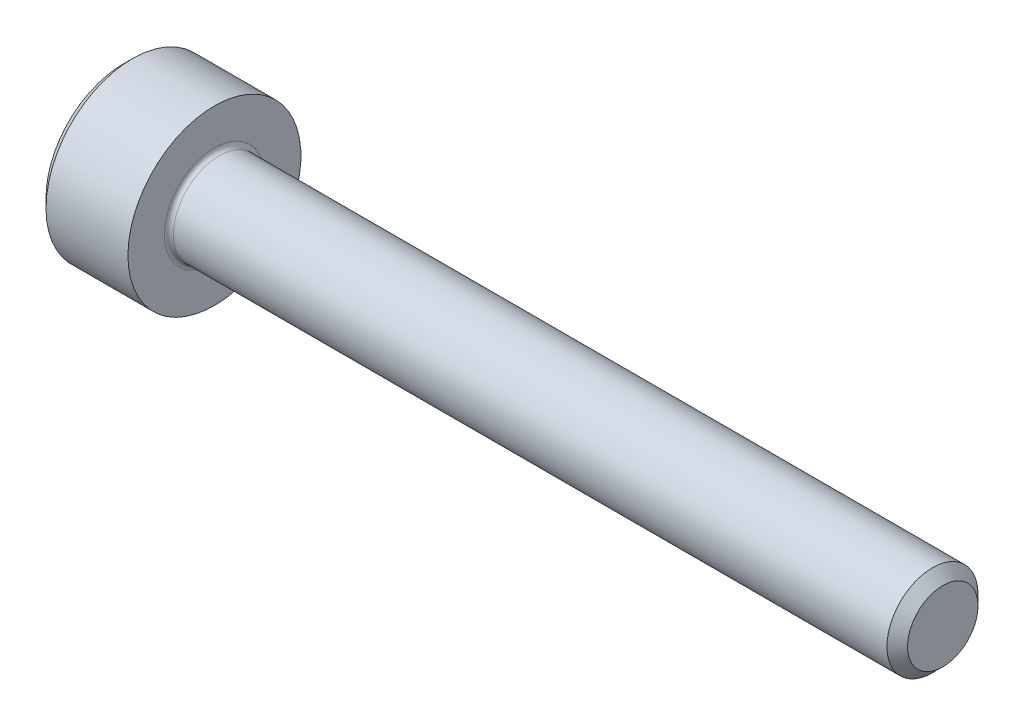
ISO-10303-21;
HEADER;
FILE_DESCRIPTION(('STEP AP214'),'2;1');
FILE_NAME('part.step','',(''),(''),'','','');
FILE_SCHEMA(('AUTOMOTIVE_DESIGN { 1 0 10303 214 1 1 1 1 }'));
ENDSEC;
DATA;
#1=APPLICATION_CONTEXT('core data for automotive mechanical design processes');
#2=APPLICATION_PROTOCOL_DEFINITION('international standard','automotive_design',2000,#1);
#3=PRODUCT_CONTEXT('',#1,'mechanical');
#4=PRODUCT('Part','Part','',(#3));
#5=PRODUCT_RELATED_PRODUCT_CATEGORY('part','',(#4));
#6=PRODUCT_DEFINITION_FORMATION('','',#4);
#7=PRODUCT_DEFINITION_CONTEXT('part definition',#1,'design');
#8=PRODUCT_DEFINITION('design','',#6,#7);
#9=PRODUCT_DEFINITION_SHAPE('','',#8);
#10=(LENGTH_UNIT() NAMED_UNIT(*) SI_UNIT(.MILLI.,.METRE.));
#11=(NAMED_UNIT(*) PLANE_ANGLE_UNIT() SI_UNIT($,.RADIAN.));
#12=(NAMED_UNIT(*) SI_UNIT($,.STERADIAN.) SOLID_ANGLE_UNIT());
#13=UNCERTAINTY_MEASURE_WITH_UNIT(LENGTH_MEASURE(1.E-05),#10,'distance_accuracy_value','');
#14=(GEOMETRIC_REPRESENTATION_CONTEXT(3) GLOBAL_UNCERTAINTY_ASSIGNED_CONTEXT((#13)) GLOBAL_UNIT_ASSIGNED_CONTEXT((#10,
#11,#12)) REPRESENTATION_CONTEXT('',''));
#15=CARTESIAN_POINT('',(0.,0.,0.));
#16=DIRECTION('',(0.,0.,1.));
#17=DIRECTION('',(1.,0.,0.));
#18=AXIS2_PLACEMENT_3D('',#15,#16,#17);
#19=CARTESIAN_POINT('',(0.,0.,0.));
#20=DIRECTION('',(-1.,0.,0.));
#21=DIRECTION('',(0.,0.,1.));
#22=AXIS2_PLACEMENT_3D('',#19,#20,#21);
#23=PLANE('',#22);
#24=DIRECTION('',(0.,-0.5,0.866025403784439));
#25=VECTOR('',#24,1.);
#26=CARTESIAN_POINT('',(0.,0.892006165897969,0.));
#27=LINE('',#26,#25);
#28=CARTESIAN_POINT('',(0.,0.892006165897969,0.));
#29=VERTEX_POINT('',#28);
#30=CARTESIAN_POINT('',(0.,0.446003082948983,0.772499999999997));
#31=VERTEX_POINT('',#30);
#32=EDGE_CURVE('E391',#29,#31,#27,.T.);
#33=ORIENTED_EDGE('',*,*,#32,.T.);
#34=DIRECTION('',(0.,1.,0.));
#35=VECTOR('',#34,1.);
#36=CARTESIAN_POINT('',(0.,-0.446003082948989,0.772499999999998));
#37=LINE('',#36,#35);
#38=CARTESIAN_POINT('',(0.,-0.446003082948989,0.772499999999998));
#39=VERTEX_POINT('',#38);
#40=EDGE_CURVE('E135',#39,#31,#37,.T.);
#41=ORIENTED_EDGE('',*,*,#40,.F.);
#42=DIRECTION('',(0.,-0.500000000000001,-0.866025403784438));
#43=VECTOR('',#42,1.);
#44=CARTESIAN_POINT('',(0.,-0.446003082948989,0.772499999999998));
#45=LINE('',#44,#43);
#46=CARTESIAN_POINT('',(0.,-0.892006165897975,0.));
#47=VERTEX_POINT('',#46);
#48=EDGE_CURVE('E394',#39,#47,#45,.T.);
#49=ORIENTED_EDGE('',*,*,#48,.T.);
#50=DIRECTION('',(0.,0.5,-0.866025403784439));
#51=VECTOR('',#50,1.);
#52=CARTESIAN_POINT('',(0.,-0.892006165897975,0.));
#53=LINE('',#52,#51);
#54=CARTESIAN_POINT('',(0.,-0.44600308294899,-0.772500000000002));
#55=VERTEX_POINT('',#54);
#56=EDGE_CURVE('E397',#47,#55,#53,.T.);
#57=ORIENTED_EDGE('',*,*,#56,.T.);
#58=DIRECTION('',(0.,-1.,0.));
#59=VECTOR('',#58,1.);
#60=CARTESIAN_POINT('',(0.,0.446003082948982,-0.772500000000003));
#61=LINE('',#60,#59);
#62=CARTESIAN_POINT('',(0.,0.446003082948982,-0.772500000000003));
#63=VERTEX_POINT('',#62);
#64=EDGE_CURVE('E400',#63,#55,#61,.T.);
#65=ORIENTED_EDGE('',*,*,#64,.F.);
#66=DIRECTION('',(0.,-0.500000000000001,-0.866025403784438));
#67=VECTOR('',#66,1.);
#68=CARTESIAN_POINT('',(0.,0.892006165897969,0.));
#69=LINE('',#68,#67);
#70=EDGE_CURVE('E130',#29,#63,#69,.T.);
#71=ORIENTED_EDGE('',*,*,#70,.F.);
#72=EDGE_LOOP('',(#33,#41,#49,#57,#65,#71));
#73=FACE_BOUND('',#72,.T.);
#74=CARTESIAN_POINT('',(0.,0.,0.));
#75=DIRECTION('',(-1.,0.,0.));
#76=DIRECTION('',(0.,0.,1.));
#77=AXIS2_PLACEMENT_3D('',#74,#75,#76);
#78=CIRCLE('',#77,1.7);
#79=CARTESIAN_POINT('',(0.,0.,1.7));
#80=VERTEX_POINT('',#79);
#81=EDGE_CURVE('E146',#80,#80,#78,.T.);
#82=ORIENTED_EDGE('',*,*,#81,.T.);
#83=EDGE_LOOP('',(#82));
#84=FACE_BOUND('',#83,.T.);
#85=ADVANCED_FACE('F39',(#73,#84),#23,.T.);
#86=CARTESIAN_POINT('',(18.,0.774,0.));
#87=DIRECTION('',(1.,0.,0.));
#88=DIRECTION('',(0.,0.,-1.));
#89=AXIS2_PLACEMENT_3D('',#86,#87,#88);
#90=PLANE('',#89);
#91=CARTESIAN_POINT('',(18.,0.,0.));
#92=DIRECTION('',(-1.,0.,0.));
#93=DIRECTION('',(0.,0.,1.));
#94=AXIS2_PLACEMENT_3D('',#91,#92,#93);
#95=CIRCLE('',#94,0.774);
#96=CARTESIAN_POINT('',(18.,0.,0.774));
#97=VERTEX_POINT('',#96);
#98=EDGE_CURVE('E159',#97,#97,#95,.T.);
#99=ORIENTED_EDGE('',*,*,#98,.F.);
#100=EDGE_LOOP('',(#99));
#101=FACE_BOUND('',#100,.T.);
#102=ADVANCED_FACE('F180',(#101),#90,.T.);
#103=CARTESIAN_POINT('',(18.,0.,0.));
#104=DIRECTION('',(-1.,0.,0.));
#105=DIRECTION('',(0.,0.,1.));
#106=AXIS2_PLACEMENT_3D('',#103,#104,#105);
#107=CONICAL_SURFACE('',#106,0.774,0.78539816339747);
#108=CARTESIAN_POINT('',(17.774,0.,0.));
#109=DIRECTION('',(-1.,0.,0.));
#110=DIRECTION('',(0.,0.,1.));
#111=AXIS2_PLACEMENT_3D('',#108,#109,#110);
#112=CIRCLE('',#111,1.);
#113=CARTESIAN_POINT('',(17.774,0.,1.));
#114=VERTEX_POINT('',#113);
#115=EDGE_CURVE('E156',#114,#114,#112,.T.);
#116=ORIENTED_EDGE('',*,*,#115,.F.);
#117=EDGE_LOOP('',(#116));
#118=FACE_BOUND('',#117,.T.);
#119=ORIENTED_EDGE('',*,*,#98,.T.);
#120=EDGE_LOOP('',(#119));
#121=FACE_BOUND('',#120,.T.);
#122=ADVANCED_FACE('F186',(#118,#121),#107,.T.);
#123=CARTESIAN_POINT('',(-31.75,0.,0.));
#124=DIRECTION('',(-1.,0.,0.));
#125=DIRECTION('',(0.,0.,1.));
#126=AXIS2_PLACEMENT_3D('',#123,#124,#125);
#127=CYLINDRICAL_SURFACE('',#126,1.);
#128=CARTESIAN_POINT('',(2.1,0.,0.));
#129=DIRECTION('',(1.,0.,0.));
#130=DIRECTION('',(0.,0.,-1.));
#131=AXIS2_PLACEMENT_3D('',#128,#129,#130);
#132=CIRCLE('',#131,1.);
#133=CARTESIAN_POINT('',(2.1,0.,-1.));
#134=VERTEX_POINT('',#133);
#135=EDGE_CURVE('E11',#134,#134,#132,.T.);
#136=ORIENTED_EDGE('',*,*,#135,.T.);
#137=EDGE_LOOP('',(#136));
#138=FACE_BOUND('',#137,.T.);
#139=ORIENTED_EDGE('',*,*,#115,.T.);
#140=EDGE_LOOP('',(#139));
#141=FACE_BOUND('',#140,.T.);
#142=ADVANCED_FACE('F197',(#138,#141),#127,.T.);
#143=CARTESIAN_POINT('',(2.,1.9,0.));
#144=DIRECTION('',(1.,0.,0.));
#145=DIRECTION('',(0.,0.,-1.));
#146=AXIS2_PLACEMENT_3D('',#143,#144,#145);
#147=PLANE('',#146);
#148=CARTESIAN_POINT('',(2.,0.,0.));
#149=DIRECTION('',(1.,0.,0.));
#150=DIRECTION('',(0.,0.,-1.));
#151=AXIS2_PLACEMENT_3D('',#148,#149,#150);
#152=CIRCLE('',#151,1.1);
#153=CARTESIAN_POINT('',(2.,0.,-1.1));
#154=VERTEX_POINT('',#153);
#155=EDGE_CURVE('E47',#154,#154,#152,.F.);
#156=ORIENTED_EDGE('',*,*,#155,.T.);
#157=EDGE_LOOP('',(#156));
#158=FACE_BOUND('',#157,.T.);
#159=CARTESIAN_POINT('',(2.,0.,0.));
#160=DIRECTION('',(-1.,0.,0.));
#161=DIRECTION('',(0.,0.,1.));
#162=AXIS2_PLACEMENT_3D('',#159,#160,#161);
#163=CIRCLE('',#162,1.9);
#164=CARTESIAN_POINT('',(2.,0.,1.9));
#165=VERTEX_POINT('',#164);
#166=EDGE_CURVE('E153',#165,#165,#163,.T.);
#167=ORIENTED_EDGE('',*,*,#166,.F.);
#168=EDGE_LOOP('',(#167));
#169=FACE_BOUND('',#168,.T.);
#170=ADVANCED_FACE('F164',(#158,#169),#147,.T.);
#171=CARTESIAN_POINT('',(-31.75,0.,0.));
#172=DIRECTION('',(-1.,0.,0.));
#173=DIRECTION('',(0.,0.,1.));
#174=AXIS2_PLACEMENT_3D('',#171,#172,#173);
#175=CYLINDRICAL_SURFACE('',#174,1.9);
#176=ORIENTED_EDGE('',*,*,#166,.T.);
#177=EDGE_LOOP('',(#176));
#178=FACE_BOUND('',#177,.T.);
#179=CARTESIAN_POINT('',(0.199999999999999,0.,0.));
#180=DIRECTION('',(-1.,0.,0.));
#181=DIRECTION('',(0.,0.,1.));
#182=AXIS2_PLACEMENT_3D('',#179,#180,#181);
#183=CIRCLE('',#182,1.9);
#184=CARTESIAN_POINT('',(0.199999999999999,0.,1.9));
#185=VERTEX_POINT('',#184);
#186=EDGE_CURVE('E150',#185,#185,#183,.T.);
#187=ORIENTED_EDGE('',*,*,#186,.F.);
#188=EDGE_LOOP('',(#187));
#189=FACE_BOUND('',#188,.T.);
#190=ADVANCED_FACE('F175',(#178,#189),#175,.T.);
#191=CARTESIAN_POINT('',(0.,0.,0.));
#192=DIRECTION('',(1.,0.,0.));
#193=DIRECTION('',(0.,0.,-1.));
#194=AXIS2_PLACEMENT_3D('',#191,#192,#193);
#195=CONICAL_SURFACE('',#194,1.7,0.785398163397449);
#196=ORIENTED_EDGE('',*,*,#186,.T.);
#197=EDGE_LOOP('',(#196));
#198=FACE_BOUND('',#197,.T.);
#199=ORIENTED_EDGE('',*,*,#81,.F.);
#200=EDGE_LOOP('',(#199));
#201=FACE_BOUND('',#200,.T.);
#202=ADVANCED_FACE('F168',(#198,#201),#195,.T.);
#203=CARTESIAN_POINT('',(2.1,0.,0.));
#204=DIRECTION('',(1.,0.,0.));
#205=DIRECTION('',(0.,0.,-1.));
#206=AXIS2_PLACEMENT_3D('',#203,#204,#205);
#207=TOROIDAL_SURFACE('',#206,1.1,0.1);
#208=ORIENTED_EDGE('',*,*,#135,.F.);
#209=EDGE_LOOP('',(#208));
#210=FACE_BOUND('',#209,.T.);
#211=ORIENTED_EDGE('',*,*,#155,.F.);
#212=EDGE_LOOP('',(#211));
#213=FACE_BOUND('',#212,.T.);
#214=ADVANCED_FACE('F41',(#210,#213),#207,.F.);
#215=CARTESIAN_POINT('',(1.,0.892006165897969,0.));
#216=DIRECTION('',(0.,-0.866025403784439,-0.5));
#217=DIRECTION('',(0.,0.5,-0.866025403784439));
#218=AXIS2_PLACEMENT_3D('',#215,#216,#217);
#219=PLANE('',#218);
#220=ORIENTED_EDGE('',*,*,#32,.F.);
#221=DIRECTION('',(-1.,0.,0.));
#222=VECTOR('',#221,1.);
#223=CARTESIAN_POINT('',(1.,0.892006165897969,0.));
#224=LINE('',#223,#222);
#225=CARTESIAN_POINT('',(1.,0.892006165897969,0.));
#226=VERTEX_POINT('',#225);
#227=EDGE_CURVE('E381',#226,#29,#224,.T.);
#228=ORIENTED_EDGE('',*,*,#227,.F.);
#229=DIRECTION('',(0.,-0.5,0.866025403784439));
#230=VECTOR('',#229,1.);
#231=CARTESIAN_POINT('',(1.,0.892006165897969,0.));
#232=LINE('',#231,#230);
#233=CARTESIAN_POINT('',(1.,0.669004624423476,0.386249999999998));
#234=VERTEX_POINT('',#233);
#235=EDGE_CURVE('E122',#226,#234,#232,.T.);
#236=ORIENTED_EDGE('',*,*,#235,.T.);
#237=CARTESIAN_POINT('',(1.,0.446003082948983,0.772499999999997));
#238=VERTEX_POINT('',#237);
#239=EDGE_CURVE('E113',#234,#238,#232,.T.);
#240=ORIENTED_EDGE('',*,*,#239,.T.);
#241=DIRECTION('',(-1.,0.,0.));
#242=VECTOR('',#241,1.);
#243=CARTESIAN_POINT('',(1.,0.446003082948983,0.772499999999997));
#244=LINE('',#243,#242);
#245=EDGE_CURVE('E127',#238,#31,#244,.T.);
#246=ORIENTED_EDGE('',*,*,#245,.T.);
#247=EDGE_LOOP('',(#220,#228,#236,#240,#246));
#248=FACE_BOUND('',#247,.T.);
#249=ADVANCED_FACE('F126',(#248),#219,.T.);
#250=CARTESIAN_POINT('',(1.,-0.446003082948989,0.772499999999998));
#251=DIRECTION('',(0.,0.,1.));
#252=DIRECTION('',(0.,-1.,0.));
#253=AXIS2_PLACEMENT_3D('',#250,#251,#252);
#254=PLANE('',#253);
#255=ORIENTED_EDGE('',*,*,#40,.T.);
#256=ORIENTED_EDGE('',*,*,#245,.F.);
#257=DIRECTION('',(0.,1.,0.));
#258=VECTOR('',#257,1.);
#259=CARTESIAN_POINT('',(1.,-0.446003082948989,0.772499999999998));
#260=LINE('',#259,#258);
#261=CARTESIAN_POINT('',(1.,0.,0.772499999999998));
#262=VERTEX_POINT('',#261);
#263=EDGE_CURVE('E110',#262,#238,#260,.T.);
#264=ORIENTED_EDGE('',*,*,#263,.F.);
#265=CARTESIAN_POINT('',(1.,-0.446003082948989,0.772499999999998));
#266=VERTEX_POINT('',#265);
#267=EDGE_CURVE('E121',#266,#262,#260,.T.);
#268=ORIENTED_EDGE('',*,*,#267,.F.);
#269=DIRECTION('',(-1.,0.,0.));
#270=VECTOR('',#269,1.);
#271=CARTESIAN_POINT('',(1.,-0.446003082948989,0.772499999999998));
#272=LINE('',#271,#270);
#273=EDGE_CURVE('E137',#266,#39,#272,.T.);
#274=ORIENTED_EDGE('',*,*,#273,.T.);
#275=EDGE_LOOP('',(#255,#256,#264,#268,#274));
#276=FACE_BOUND('',#275,.T.);
#277=ADVANCED_FACE('F132',(#276),#254,.F.);
#278=CARTESIAN_POINT('',(1.,-0.446003082948989,0.772499999999998));
#279=DIRECTION('',(0.,0.866025403784438,-0.500000000000001));
#280=DIRECTION('',(0.,0.500000000000001,0.866025403784438));
#281=AXIS2_PLACEMENT_3D('',#278,#279,#280);
#282=PLANE('',#281);
#283=ORIENTED_EDGE('',*,*,#48,.F.);
#284=ORIENTED_EDGE('',*,*,#273,.F.);
#285=DIRECTION('',(0.,-0.500000000000001,-0.866025403784438));
#286=VECTOR('',#285,1.);
#287=CARTESIAN_POINT('',(1.,-0.446003082948989,0.772499999999998));
#288=LINE('',#287,#286);
#289=CARTESIAN_POINT('',(1.,-0.66900462442348,0.386250000000002));
#290=VERTEX_POINT('',#289);
#291=EDGE_CURVE('E420',#266,#290,#288,.T.);
#292=ORIENTED_EDGE('',*,*,#291,.T.);
#293=CARTESIAN_POINT('',(1.,-0.892006165897975,0.));
#294=VERTEX_POINT('',#293);
#295=EDGE_CURVE('E409',#290,#294,#288,.T.);
#296=ORIENTED_EDGE('',*,*,#295,.T.);
#297=DIRECTION('',(-1.,0.,0.));
#298=VECTOR('',#297,1.);
#299=CARTESIAN_POINT('',(1.,-0.892006165897975,0.));
#300=LINE('',#299,#298);
#301=EDGE_CURVE('E142',#294,#47,#300,.T.);
#302=ORIENTED_EDGE('',*,*,#301,.T.);
#303=EDGE_LOOP('',(#283,#284,#292,#296,#302));
#304=FACE_BOUND('',#303,.T.);
#305=ADVANCED_FACE('F272',(#304),#282,.T.);
#306=CARTESIAN_POINT('',(1.,-0.892006165897975,0.));
#307=DIRECTION('',(0.,0.866025403784439,0.5));
#308=DIRECTION('',(0.,-0.5,0.866025403784439));
#309=AXIS2_PLACEMENT_3D('',#306,#307,#308);
#310=PLANE('',#309);
#311=ORIENTED_EDGE('',*,*,#56,.F.);
#312=ORIENTED_EDGE('',*,*,#301,.F.);
#313=DIRECTION('',(0.,0.5,-0.866025403784439));
#314=VECTOR('',#313,1.);
#315=CARTESIAN_POINT('',(1.,-0.892006165897975,0.));
#316=LINE('',#315,#314);
#317=CARTESIAN_POINT('',(1.,-0.669004624423482,-0.386250000000002));
#318=VERTEX_POINT('',#317);
#319=EDGE_CURVE('E387',#294,#318,#316,.T.);
#320=ORIENTED_EDGE('',*,*,#319,.T.);
#321=CARTESIAN_POINT('',(1.,-0.44600308294899,-0.772500000000002));
#322=VERTEX_POINT('',#321);
#323=EDGE_CURVE('E419',#318,#322,#316,.T.);
#324=ORIENTED_EDGE('',*,*,#323,.T.);
#325=DIRECTION('',(-1.,0.,0.));
#326=VECTOR('',#325,1.);
#327=CARTESIAN_POINT('',(1.,-0.44600308294899,-0.772500000000002));
#328=LINE('',#327,#326);
#329=EDGE_CURVE('E380',#322,#55,#328,.T.);
#330=ORIENTED_EDGE('',*,*,#329,.T.);
#331=EDGE_LOOP('',(#311,#312,#320,#324,#330));
#332=FACE_BOUND('',#331,.T.);
#333=ADVANCED_FACE('F280',(#332),#310,.T.);
#334=CARTESIAN_POINT('',(1.,0.446003082948982,-0.772500000000003));
#335=DIRECTION('',(0.,0.,-1.));
#336=DIRECTION('',(0.,1.,0.));
#337=AXIS2_PLACEMENT_3D('',#334,#335,#336);
#338=PLANE('',#337);
#339=ORIENTED_EDGE('',*,*,#64,.T.);
#340=ORIENTED_EDGE('',*,*,#329,.F.);
#341=DIRECTION('',(0.,-1.,0.));
#342=VECTOR('',#341,1.);
#343=CARTESIAN_POINT('',(1.,0.446003082948982,-0.772500000000003));
#344=LINE('',#343,#342);
#345=CARTESIAN_POINT('',(1.,0.,-0.7725));
#346=VERTEX_POINT('',#345);
#347=EDGE_CURVE('E384',#346,#322,#344,.T.);
#348=ORIENTED_EDGE('',*,*,#347,.F.);
#349=CARTESIAN_POINT('',(1.,0.446003082948982,-0.772500000000003));
#350=VERTEX_POINT('',#349);
#351=EDGE_CURVE('E54',#350,#346,#344,.T.);
#352=ORIENTED_EDGE('',*,*,#351,.F.);
#353=DIRECTION('',(-1.,0.,0.));
#354=VECTOR('',#353,1.);
#355=CARTESIAN_POINT('',(1.,0.446003082948982,-0.772500000000003));
#356=LINE('',#355,#354);
#357=EDGE_CURVE('E377',#350,#63,#356,.T.);
#358=ORIENTED_EDGE('',*,*,#357,.T.);
#359=EDGE_LOOP('',(#339,#340,#348,#352,#358));
#360=FACE_BOUND('',#359,.T.);
#361=ADVANCED_FACE('F289',(#360),#338,.F.);
#362=CARTESIAN_POINT('',(1.,0.892006165897969,0.));
#363=DIRECTION('',(0.,0.866025403784438,-0.500000000000001));
#364=DIRECTION('',(0.,0.500000000000001,0.866025403784438));
#365=AXIS2_PLACEMENT_3D('',#362,#363,#364);
#366=PLANE('',#365);
#367=ORIENTED_EDGE('',*,*,#70,.T.);
#368=ORIENTED_EDGE('',*,*,#357,.F.);
#369=DIRECTION('',(0.,-0.500000000000001,-0.866025403784438));
#370=VECTOR('',#369,1.);
#371=CARTESIAN_POINT('',(1.,0.892006165897969,0.));
#372=LINE('',#371,#370);
#373=CARTESIAN_POINT('',(1.,0.669004624423477,-0.38625));
#374=VERTEX_POINT('',#373);
#375=EDGE_CURVE('E367',#374,#350,#372,.T.);
#376=ORIENTED_EDGE('',*,*,#375,.F.);
#377=EDGE_CURVE('E373',#226,#374,#372,.T.);
#378=ORIENTED_EDGE('',*,*,#377,.F.);
#379=ORIENTED_EDGE('',*,*,#227,.T.);
#380=EDGE_LOOP('',(#367,#368,#376,#378,#379));
#381=FACE_BOUND('',#380,.T.);
#382=ADVANCED_FACE('F298',(#381),#366,.F.);
#383=CARTESIAN_POINT('',(1.,0.892006165897969,0.));
#384=DIRECTION('',(1.,0.,0.));
#385=DIRECTION('',(0.,0.,-1.));
#386=AXIS2_PLACEMENT_3D('',#383,#384,#385);
#387=PLANE('',#386);
#388=ORIENTED_EDGE('',*,*,#347,.T.);
#389=ORIENTED_EDGE('',*,*,#323,.F.);
#390=CARTESIAN_POINT('',(1.,0.,0.));
#391=DIRECTION('',(-1.,0.,0.));
#392=DIRECTION('',(0.,0.,1.));
#393=AXIS2_PLACEMENT_3D('',#390,#391,#392);
#394=CIRCLE('',#393,0.7725);
#395=EDGE_CURVE('E415',#346,#318,#394,.T.);
#396=ORIENTED_EDGE('',*,*,#395,.F.);
#397=EDGE_LOOP('',(#388,#389,#396));
#398=FACE_BOUND('',#397,.T.);
#399=ADVANCED_FACE('F307',(#398),#387,.F.);
#400=ORIENTED_EDGE('',*,*,#319,.F.);
#401=ORIENTED_EDGE('',*,*,#295,.F.);
#402=EDGE_CURVE('E140',#318,#290,#394,.T.);
#403=ORIENTED_EDGE('',*,*,#402,.F.);
#404=EDGE_LOOP('',(#400,#401,#403));
#405=FACE_BOUND('',#404,.T.);
#406=ADVANCED_FACE('F316',(#405),#387,.F.);
#407=ORIENTED_EDGE('',*,*,#291,.F.);
#408=ORIENTED_EDGE('',*,*,#267,.T.);
#409=EDGE_CURVE('E136',#290,#262,#394,.T.);
#410=ORIENTED_EDGE('',*,*,#409,.F.);
#411=EDGE_LOOP('',(#407,#408,#410));
#412=FACE_BOUND('',#411,.T.);
#413=ADVANCED_FACE('F325',(#412),#387,.F.);
#414=ORIENTED_EDGE('',*,*,#263,.T.);
#415=ORIENTED_EDGE('',*,*,#239,.F.);
#416=EDGE_CURVE('E116',#262,#234,#394,.T.);
#417=ORIENTED_EDGE('',*,*,#416,.F.);
#418=EDGE_LOOP('',(#414,#415,#417));
#419=FACE_BOUND('',#418,.T.);
#420=ADVANCED_FACE('F112',(#419),#387,.F.);
#421=ORIENTED_EDGE('',*,*,#235,.F.);
#422=ORIENTED_EDGE('',*,*,#377,.T.);
#423=EDGE_CURVE('E147',#234,#374,#394,.T.);
#424=ORIENTED_EDGE('',*,*,#423,.F.);
#425=EDGE_LOOP('',(#421,#422,#424));
#426=FACE_BOUND('',#425,.T.);
#427=ADVANCED_FACE('F340',(#426),#387,.F.);
#428=ORIENTED_EDGE('',*,*,#375,.T.);
#429=ORIENTED_EDGE('',*,*,#351,.T.);
#430=EDGE_CURVE('E370',#374,#346,#394,.T.);
#431=ORIENTED_EDGE('',*,*,#430,.F.);
#432=EDGE_LOOP('',(#428,#429,#431));
#433=FACE_BOUND('',#432,.T.);
#434=ADVANCED_FACE('F255',(#433),#387,.F.);
#435=CARTESIAN_POINT('',(1.,0.,0.));
#436=DIRECTION('',(-1.,0.,0.));
#437=DIRECTION('',(0.,0.,1.));
#438=AXIS2_PLACEMENT_3D('',#435,#436,#437);
#439=CONICAL_SURFACE('',#438,0.7725,1.04719755119659);
#440=CARTESIAN_POINT('',(1.446003082949,0.,0.));
#441=VERTEX_POINT('',#440);
#442=VERTEX_LOOP('',#441);
#443=FACE_BOUND('',#442,.T.);
#444=ORIENTED_EDGE('',*,*,#416,.T.);
#445=ORIENTED_EDGE('',*,*,#423,.T.);
#446=ORIENTED_EDGE('',*,*,#430,.T.);
#447=ORIENTED_EDGE('',*,*,#395,.T.);
#448=ORIENTED_EDGE('',*,*,#402,.T.);
#449=ORIENTED_EDGE('',*,*,#409,.T.);
#450=EDGE_LOOP('',(#444,#445,#446,#447,#448,#449));
#451=FACE_BOUND('',#450,.T.);
#452=ADVANCED_FACE('F190',(#443,#451),#439,.F.);
#453=CLOSED_SHELL('',(#85,#102,#122,#142,#170,#190,#202,#214,#249,#277,#305,#333,#361,#382,#399,
#406,#413,#420,#427,#434,#452));
#454=MANIFOLD_SOLID_BREP('B2',#453);
#455=ADVANCED_BREP_SHAPE_REPRESENTATION('',(#18,#454),#14);
#456=SHAPE_DEFINITION_REPRESENTATION(#9,#455);
ENDSEC;
END-ISO-10303-21;
